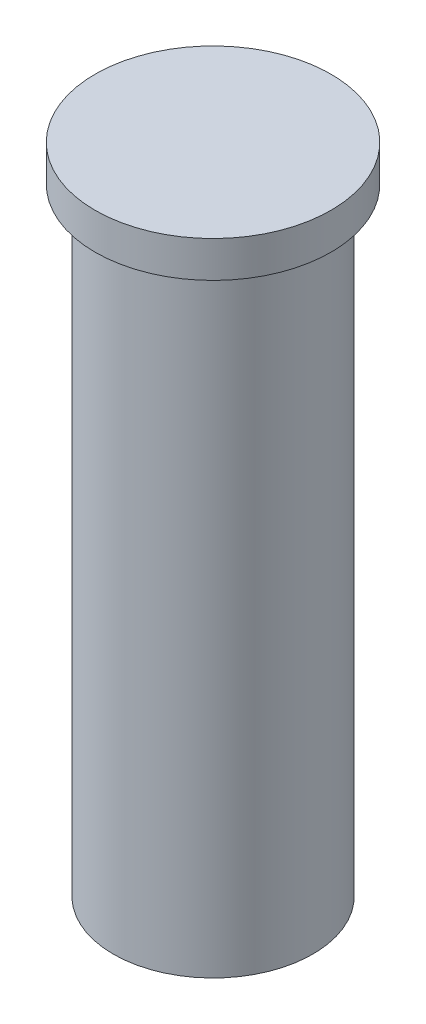
ISO-10303-21;
HEADER;
FILE_DESCRIPTION(('STEP AP214'),'2;1');
FILE_NAME('part.step','',(''),(''),'','','');
FILE_SCHEMA(('AUTOMOTIVE_DESIGN { 1 0 10303 214 1 1 1 1 }'));
ENDSEC;
DATA;
#1=APPLICATION_CONTEXT('core data for automotive mechanical design processes');
#2=APPLICATION_PROTOCOL_DEFINITION('international standard','automotive_design',2000,#1);
#3=PRODUCT_CONTEXT('',#1,'mechanical');
#4=PRODUCT('Part','Part','',(#3));
#5=PRODUCT_RELATED_PRODUCT_CATEGORY('part','',(#4));
#6=PRODUCT_DEFINITION_FORMATION('','',#4);
#7=PRODUCT_DEFINITION_CONTEXT('part definition',#1,'design');
#8=PRODUCT_DEFINITION('design','',#6,#7);
#9=PRODUCT_DEFINITION_SHAPE('','',#8);
#10=(LENGTH_UNIT() NAMED_UNIT(*) SI_UNIT(.MILLI.,.METRE.));
#11=(NAMED_UNIT(*) PLANE_ANGLE_UNIT() SI_UNIT($,.RADIAN.));
#12=(NAMED_UNIT(*) SI_UNIT($,.STERADIAN.) SOLID_ANGLE_UNIT());
#13=UNCERTAINTY_MEASURE_WITH_UNIT(LENGTH_MEASURE(1.E-05),#10,'distance_accuracy_value','');
#14=(GEOMETRIC_REPRESENTATION_CONTEXT(3) GLOBAL_UNCERTAINTY_ASSIGNED_CONTEXT((#13)) GLOBAL_UNIT_ASSIGNED_CONTEXT((#10,
#11,#12)) REPRESENTATION_CONTEXT('',''));
#15=CARTESIAN_POINT('',(0.,0.,0.));
#16=DIRECTION('',(0.,0.,1.));
#17=DIRECTION('',(1.,0.,0.));
#18=AXIS2_PLACEMENT_3D('',#15,#16,#17);
#19=CARTESIAN_POINT('',(0.,0.,0.));
#20=DIRECTION('',(0.,1.,0.));
#21=DIRECTION('',(0.,0.,1.));
#22=AXIS2_PLACEMENT_3D('',#19,#20,#21);
#23=PLANE('',#22);
#24=CARTESIAN_POINT('',(0.,0.,0.));
#25=DIRECTION('',(0.,1.,0.));
#26=DIRECTION('',(0.,0.,1.));
#27=AXIS2_PLACEMENT_3D('',#24,#25,#26);
#28=CIRCLE('',#27,27.5);
#29=CARTESIAN_POINT('',(0.,0.,27.5));
#30=VERTEX_POINT('',#29);
#31=EDGE_CURVE('E41',#30,#30,#28,.T.);
#32=ORIENTED_EDGE('',*,*,#31,.F.);
#33=EDGE_LOOP('',(#32));
#34=FACE_BOUND('',#33,.T.);
#35=CARTESIAN_POINT('',(0.,0.,0.));
#36=DIRECTION('',(0.,1.,0.));
#37=DIRECTION('',(0.,0.,1.));
#38=AXIS2_PLACEMENT_3D('',#35,#36,#37);
#39=CIRCLE('',#38,22.5);
#40=CARTESIAN_POINT('',(0.,0.,22.5));
#41=VERTEX_POINT('',#40);
#42=EDGE_CURVE('E50',#41,#41,#39,.T.);
#43=ORIENTED_EDGE('',*,*,#42,.T.);
#44=EDGE_LOOP('',(#43));
#45=FACE_BOUND('',#44,.T.);
#46=ADVANCED_FACE('F37',(#34,#45),#23,.F.);
#47=CARTESIAN_POINT('',(0.,170.,0.));
#48=DIRECTION('',(0.,-1.,0.));
#49=DIRECTION('',(0.,0.,-1.));
#50=AXIS2_PLACEMENT_3D('',#47,#48,#49);
#51=CYLINDRICAL_SURFACE('',#50,27.5);
#52=CARTESIAN_POINT('',(0.,170.,0.));
#53=DIRECTION('',(0.,1.,0.));
#54=DIRECTION('',(0.,0.,1.));
#55=AXIS2_PLACEMENT_3D('',#52,#53,#54);
#56=CIRCLE('',#55,27.5);
#57=CARTESIAN_POINT('',(0.,170.,27.5));
#58=VERTEX_POINT('',#57);
#59=EDGE_CURVE('E10',#58,#58,#56,.T.);
#60=ORIENTED_EDGE('',*,*,#59,.F.);
#61=EDGE_LOOP('',(#60));
#62=FACE_BOUND('',#61,.T.);
#63=ORIENTED_EDGE('',*,*,#31,.T.);
#64=EDGE_LOOP('',(#63));
#65=FACE_BOUND('',#64,.T.);
#66=ADVANCED_FACE('F39',(#62,#65),#51,.T.);
#67=CARTESIAN_POINT('',(0.,170.,0.));
#68=DIRECTION('',(0.,-1.,0.));
#69=DIRECTION('',(0.,0.,-1.));
#70=AXIS2_PLACEMENT_3D('',#67,#68,#69);
#71=CYLINDRICAL_SURFACE('',#70,22.5);
#72=CARTESIAN_POINT('',(0.,170.,0.));
#73=DIRECTION('',(0.,1.,0.));
#74=DIRECTION('',(0.,0.,1.));
#75=AXIS2_PLACEMENT_3D('',#72,#73,#74);
#76=CIRCLE('',#75,22.5);
#77=CARTESIAN_POINT('',(0.,170.,22.5));
#78=VERTEX_POINT('',#77);
#79=EDGE_CURVE('E55',#78,#78,#76,.T.);
#80=ORIENTED_EDGE('',*,*,#79,.T.);
#81=EDGE_LOOP('',(#80));
#82=FACE_BOUND('',#81,.T.);
#83=ORIENTED_EDGE('',*,*,#42,.F.);
#84=EDGE_LOOP('',(#83));
#85=FACE_BOUND('',#84,.T.);
#86=ADVANCED_FACE('F85',(#82,#85),#71,.F.);
#87=CARTESIAN_POINT('',(0.,170.,0.));
#88=DIRECTION('',(0.,1.,0.));
#89=DIRECTION('',(0.,0.,1.));
#90=AXIS2_PLACEMENT_3D('',#87,#88,#89);
#91=PLANE('',#90);
#92=ORIENTED_EDGE('',*,*,#79,.F.);
#93=EDGE_LOOP('',(#92));
#94=FACE_BOUND('',#93,.T.);
#95=ADVANCED_FACE('F73',(#94),#91,.F.);
#96=CARTESIAN_POINT('',(0.,180.,0.));
#97=DIRECTION('',(0.,-1.,0.));
#98=DIRECTION('',(0.,0.,-1.));
#99=AXIS2_PLACEMENT_3D('',#96,#97,#98);
#100=CYLINDRICAL_SURFACE('',#99,32.5);
#101=CARTESIAN_POINT('',(0.,180.,0.));
#102=DIRECTION('',(0.,1.,0.));
#103=DIRECTION('',(0.,0.,1.));
#104=AXIS2_PLACEMENT_3D('',#101,#102,#103);
#105=CIRCLE('',#104,32.5);
#106=CARTESIAN_POINT('',(0.,180.,32.5));
#107=VERTEX_POINT('',#106);
#108=EDGE_CURVE('E59',#107,#107,#105,.T.);
#109=ORIENTED_EDGE('',*,*,#108,.F.);
#110=EDGE_LOOP('',(#109));
#111=FACE_BOUND('',#110,.T.);
#112=CARTESIAN_POINT('',(0.,170.,0.));
#113=DIRECTION('',(0.,1.,0.));
#114=DIRECTION('',(0.,0.,1.));
#115=AXIS2_PLACEMENT_3D('',#112,#113,#114);
#116=CIRCLE('',#115,32.5);
#117=CARTESIAN_POINT('',(0.,170.,32.5));
#118=VERTEX_POINT('',#117);
#119=EDGE_CURVE('E60',#118,#118,#116,.T.);
#120=ORIENTED_EDGE('',*,*,#119,.T.);
#121=EDGE_LOOP('',(#120));
#122=FACE_BOUND('',#121,.T.);
#123=ADVANCED_FACE('F70',(#111,#122),#100,.T.);
#124=CARTESIAN_POINT('',(0.,180.,0.));
#125=DIRECTION('',(0.,1.,0.));
#126=DIRECTION('',(0.,0.,1.));
#127=AXIS2_PLACEMENT_3D('',#124,#125,#126);
#128=PLANE('',#127);
#129=ORIENTED_EDGE('',*,*,#108,.T.);
#130=EDGE_LOOP('',(#129));
#131=FACE_BOUND('',#130,.T.);
#132=ADVANCED_FACE('F68',(#131),#128,.T.);
#133=ORIENTED_EDGE('',*,*,#59,.T.);
#134=EDGE_LOOP('',(#133));
#135=FACE_BOUND('',#134,.T.);
#136=ORIENTED_EDGE('',*,*,#119,.F.);
#137=EDGE_LOOP('',(#136));
#138=FACE_BOUND('',#137,.T.);
#139=ADVANCED_FACE('F77',(#135,#138),#91,.F.);
#140=CLOSED_SHELL('',(#46,#66,#86,#95,#123,#132,#139));
#141=MANIFOLD_SOLID_BREP('B2',#140);
#142=ADVANCED_BREP_SHAPE_REPRESENTATION('',(#18,#141),#14);
#143=SHAPE_DEFINITION_REPRESENTATION(#9,#142);
ENDSEC;
END-ISO-10303-21;
